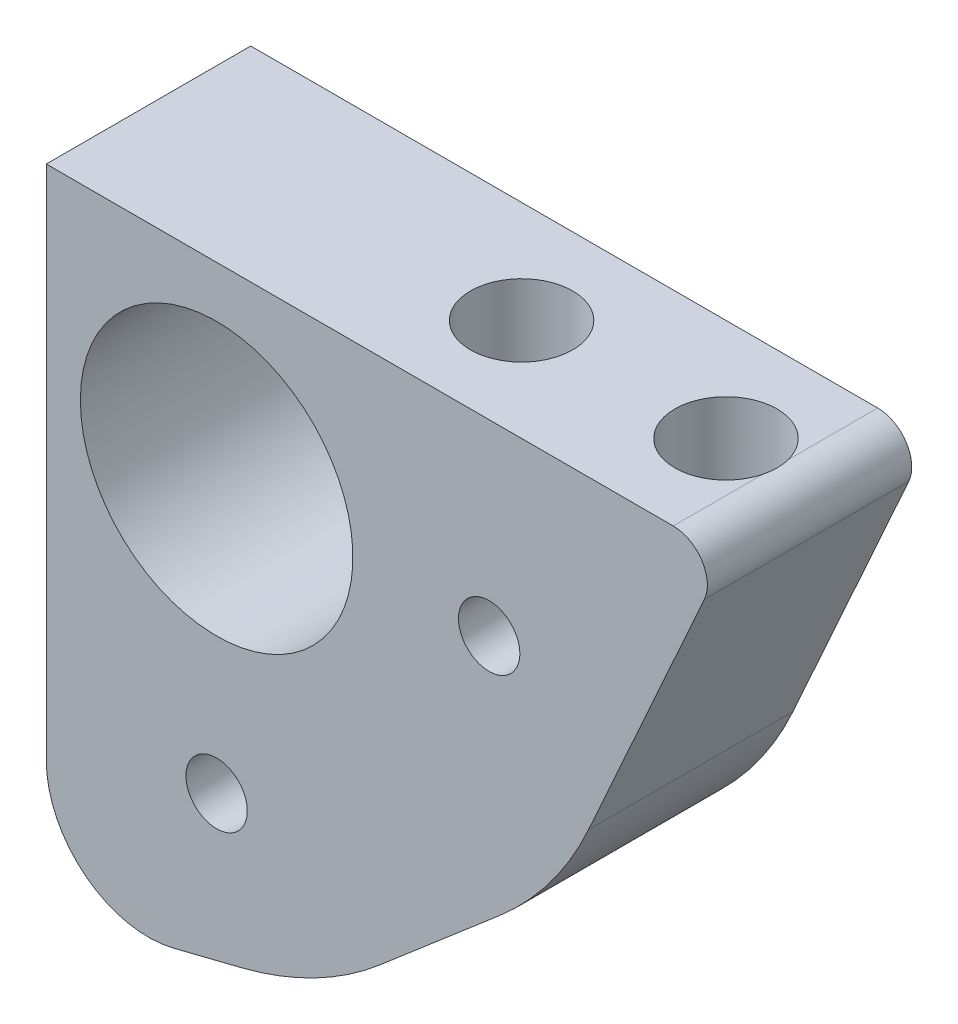
ISO-10303-21;
HEADER;
FILE_DESCRIPTION(('STEP AP214'),'2;1');
FILE_NAME('part.step','',(''),(''),'','','');
FILE_SCHEMA(('AUTOMOTIVE_DESIGN { 1 0 10303 214 1 1 1 1 }'));
ENDSEC;
DATA;
#1=APPLICATION_CONTEXT('core data for automotive mechanical design processes');
#2=APPLICATION_PROTOCOL_DEFINITION('international standard','automotive_design',2000,#1);
#3=PRODUCT_CONTEXT('',#1,'mechanical');
#4=PRODUCT('Part','Part','',(#3));
#5=PRODUCT_RELATED_PRODUCT_CATEGORY('part','',(#4));
#6=PRODUCT_DEFINITION_FORMATION('','',#4);
#7=PRODUCT_DEFINITION_CONTEXT('part definition',#1,'design');
#8=PRODUCT_DEFINITION('design','',#6,#7);
#9=PRODUCT_DEFINITION_SHAPE('','',#8);
#10=(LENGTH_UNIT() NAMED_UNIT(*) SI_UNIT(.MILLI.,.METRE.));
#11=(NAMED_UNIT(*) PLANE_ANGLE_UNIT() SI_UNIT($,.RADIAN.));
#12=(NAMED_UNIT(*) SI_UNIT($,.STERADIAN.) SOLID_ANGLE_UNIT());
#13=UNCERTAINTY_MEASURE_WITH_UNIT(LENGTH_MEASURE(1.E-05),#10,'distance_accuracy_value','');
#14=(GEOMETRIC_REPRESENTATION_CONTEXT(3) GLOBAL_UNCERTAINTY_ASSIGNED_CONTEXT((#13)) GLOBAL_UNIT_ASSIGNED_CONTEXT((#10,
#11,#12)) REPRESENTATION_CONTEXT('',''));
#15=CARTESIAN_POINT('',(0.,0.,0.));
#16=DIRECTION('',(0.,0.,1.));
#17=DIRECTION('',(1.,0.,0.));
#18=AXIS2_PLACEMENT_3D('',#15,#16,#17);
#19=CARTESIAN_POINT('',(-7.3173782982831,10.3345001147158,6.));
#20=DIRECTION('',(1.,0.,0.));
#21=DIRECTION('',(0.,0.,-1.));
#22=AXIS2_PLACEMENT_3D('',#19,#20,#21);
#23=PLANE('',#22);
#24=DIRECTION('',(0.,-1.,0.));
#25=VECTOR('',#24,1.);
#26=CARTESIAN_POINT('',(-7.3173782982831,10.3345001147158,0.));
#27=LINE('',#26,#25);
#28=CARTESIAN_POINT('',(-7.3173782982831,10.3345001147158,0.));
#29=VERTEX_POINT('',#28);
#30=CARTESIAN_POINT('',(-7.3173782982831,-4.82317066607096,0.));
#31=VERTEX_POINT('',#30);
#32=EDGE_CURVE('E187',#29,#31,#27,.T.);
#33=ORIENTED_EDGE('',*,*,#32,.T.);
#34=DIRECTION('',(0.,0.,-1.));
#35=VECTOR('',#34,1.);
#36=CARTESIAN_POINT('',(-7.3173782982831,-4.82317066607096,6.));
#37=LINE('',#36,#35);
#38=CARTESIAN_POINT('',(-7.3173782982831,-4.82317066607096,6.));
#39=VERTEX_POINT('',#38);
#40=EDGE_CURVE('E131',#31,#39,#37,.F.);
#41=ORIENTED_EDGE('',*,*,#40,.T.);
#42=DIRECTION('',(0.,-1.,0.));
#43=VECTOR('',#42,1.);
#44=CARTESIAN_POINT('',(-7.3173782982831,10.3345001147158,6.));
#45=LINE('',#44,#43);
#46=CARTESIAN_POINT('',(-7.3173782982831,10.3345001147158,6.));
#47=VERTEX_POINT('',#46);
#48=EDGE_CURVE('E173',#47,#39,#45,.T.);
#49=ORIENTED_EDGE('',*,*,#48,.F.);
#50=DIRECTION('',(0.,0.,-1.));
#51=VECTOR('',#50,1.);
#52=CARTESIAN_POINT('',(-7.3173782982831,10.3345001147158,6.));
#53=LINE('',#52,#51);
#54=EDGE_CURVE('E172',#47,#29,#53,.T.);
#55=ORIENTED_EDGE('',*,*,#54,.T.);
#56=EDGE_LOOP('',(#33,#41,#49,#55));
#57=FACE_BOUND('',#56,.T.);
#58=ADVANCED_FACE('F33',(#57),#23,.F.);
#59=CARTESIAN_POINT('',(-7.3173782982831,-8.66549988528421,6.));
#60=DIRECTION('',(-0.242535625036333,0.970142500145332,0.));
#61=DIRECTION('',(-0.970142500145332,-0.242535625036333,0.));
#62=AXIS2_PLACEMENT_3D('',#59,#60,#61);
#63=PLANE('',#62);
#64=DIRECTION('',(0.970142500145332,0.242535625036333,0.));
#65=VECTOR('',#64,1.);
#66=CARTESIAN_POINT('',(-7.3173782982831,-8.66549988528421,6.));
#67=LINE('',#66,#65);
#68=CARTESIAN_POINT('',(-3.5897714231741,-7.73359816650696,6.));
#69=VERTEX_POINT('',#68);
#70=CARTESIAN_POINT('',(-1.60757407724207,-7.23804883002395,6.));
#71=VERTEX_POINT('',#70);
#72=EDGE_CURVE('E175',#69,#71,#67,.T.);
#73=ORIENTED_EDGE('',*,*,#72,.F.);
#74=DIRECTION('',(0.,0.,-1.));
#75=VECTOR('',#74,1.);
#76=CARTESIAN_POINT('',(-3.5897714231741,-7.73359816650696,6.));
#77=LINE('',#76,#75);
#78=CARTESIAN_POINT('',(-3.5897714231741,-7.73359816650696,0.));
#79=VERTEX_POINT('',#78);
#80=EDGE_CURVE('E214',#69,#79,#77,.T.);
#81=ORIENTED_EDGE('',*,*,#80,.T.);
#82=DIRECTION('',(0.970142500145332,0.242535625036333,0.));
#83=VECTOR('',#82,1.);
#84=CARTESIAN_POINT('',(-7.3173782982831,-8.66549988528421,0.));
#85=LINE('',#84,#83);
#86=CARTESIAN_POINT('',(-1.60757407724207,-7.23804883002395,0.));
#87=VERTEX_POINT('',#86);
#88=EDGE_CURVE('E190',#79,#87,#85,.T.);
#89=ORIENTED_EDGE('',*,*,#88,.T.);
#90=DIRECTION('',(0.,0.,-1.));
#91=VECTOR('',#90,1.);
#92=CARTESIAN_POINT('',(-1.60757407724207,-7.23804883002395,6.));
#93=LINE('',#92,#91);
#94=EDGE_CURVE('E211',#87,#71,#93,.F.);
#95=ORIENTED_EDGE('',*,*,#94,.T.);
#96=EDGE_LOOP('',(#73,#81,#89,#95));
#97=FACE_BOUND('',#96,.T.);
#98=ADVANCED_FACE('F223',(#97),#63,.F.);
#99=CARTESIAN_POINT('',(7.6826217017169,-0.66549988528421,6.));
#100=DIRECTION('',(0.650791373455968,-0.759256602365296,0.));
#101=DIRECTION('',(0.759256602365297,0.650791373455968,0.));
#102=AXIS2_PLACEMENT_3D('',#99,#100,#101);
#103=PLANE('',#102);
#104=DIRECTION('',(-0.759256602365297,-0.650791373455969,0.));
#105=VECTOR('',#104,1.);
#106=CARTESIAN_POINT('',(7.6826217017169,-0.66549988528421,0.));
#107=LINE('',#106,#105);
#108=CARTESIAN_POINT('',(5.98790422580152,-2.11811486464025,0.));
#109=VERTEX_POINT('',#108);
#110=CARTESIAN_POINT('',(2.47498340695428,-5.1291898522236,0.));
#111=VERTEX_POINT('',#110);
#112=EDGE_CURVE('E163',#109,#111,#107,.T.);
#113=ORIENTED_EDGE('',*,*,#112,.F.);
#114=DIRECTION('',(0.,0.,-1.));
#115=VECTOR('',#114,1.);
#116=CARTESIAN_POINT('',(5.98790422580152,-2.11811486464025,6.));
#117=LINE('',#116,#115);
#118=CARTESIAN_POINT('',(5.98790422580152,-2.11811486464025,6.));
#119=VERTEX_POINT('',#118);
#120=EDGE_CURVE('E205',#109,#119,#117,.F.);
#121=ORIENTED_EDGE('',*,*,#120,.T.);
#122=DIRECTION('',(-0.759256602365297,-0.650791373455969,0.));
#123=VECTOR('',#122,1.);
#124=CARTESIAN_POINT('',(7.6826217017169,-0.66549988528421,6.));
#125=LINE('',#124,#123);
#126=CARTESIAN_POINT('',(2.47498340695428,-5.1291898522236,6.));
#127=VERTEX_POINT('',#126);
#128=EDGE_CURVE('E183',#119,#127,#125,.T.);
#129=ORIENTED_EDGE('',*,*,#128,.T.);
#130=DIRECTION('',(0.,0.,-1.));
#131=VECTOR('',#130,1.);
#132=CARTESIAN_POINT('',(2.47498340695428,-5.1291898522236,0.));
#133=LINE('',#132,#131);
#134=EDGE_CURVE('E202',#127,#111,#133,.T.);
#135=ORIENTED_EDGE('',*,*,#134,.T.);
#136=EDGE_LOOP('',(#113,#121,#129,#135));
#137=FACE_BOUND('',#136,.T.);
#138=ADVANCED_FACE('F232',(#137),#103,.T.);
#139=CARTESIAN_POINT('',(7.6826217017169,-0.66549988528421,6.));
#140=DIRECTION('',(-0.911880112420202,0.410456648834588,0.));
#141=DIRECTION('',(-0.410456648834588,-0.911880112420202,0.));
#142=AXIS2_PLACEMENT_3D('',#139,#140,#141);
#143=PLANE('',#142);
#144=DIRECTION('',(0.410456648834588,0.911880112420202,0.));
#145=VECTOR('',#144,1.);
#146=CARTESIAN_POINT('',(7.6826217017169,-0.66549988528421,0.));
#147=LINE('',#146,#145);
#148=CARTESIAN_POINT('',(8.59879161544386,1.36988467066684,0.));
#149=VERTEX_POINT('',#148);
#150=CARTESIAN_POINT('',(11.9990792866144,8.9240434658812,0.));
#151=VERTEX_POINT('',#150);
#152=EDGE_CURVE('E156',#149,#151,#147,.T.);
#153=ORIENTED_EDGE('',*,*,#152,.T.);
#154=DIRECTION('',(0.,0.,-1.));
#155=VECTOR('',#154,1.);
#156=CARTESIAN_POINT('',(11.9990792866144,8.9240434658812,6.));
#157=LINE('',#156,#155);
#158=CARTESIAN_POINT('',(11.9990792866144,8.9240434658812,6.));
#159=VERTEX_POINT('',#158);
#160=EDGE_CURVE('E57',#151,#159,#157,.F.);
#161=ORIENTED_EDGE('',*,*,#160,.T.);
#162=DIRECTION('',(0.410456648834588,0.911880112420202,0.));
#163=VECTOR('',#162,1.);
#164=CARTESIAN_POINT('',(7.6826217017169,-0.66549988528421,6.));
#165=LINE('',#164,#163);
#166=CARTESIAN_POINT('',(8.59879161544386,1.36988467066684,6.));
#167=VERTEX_POINT('',#166);
#168=EDGE_CURVE('E169',#167,#159,#165,.T.);
#169=ORIENTED_EDGE('',*,*,#168,.F.);
#170=DIRECTION('',(0.,0.,-1.));
#171=VECTOR('',#170,1.);
#172=CARTESIAN_POINT('',(8.59879161544386,1.36988467066684,0.));
#173=LINE('',#172,#171);
#174=EDGE_CURVE('E162',#167,#149,#173,.T.);
#175=ORIENTED_EDGE('',*,*,#174,.T.);
#176=EDGE_LOOP('',(#153,#161,#169,#175));
#177=FACE_BOUND('',#176,.T.);
#178=ADVANCED_FACE('F160',(#177),#143,.F.);
#179=CARTESIAN_POINT('',(12.6339558471642,10.3345001147158,6.));
#180=DIRECTION('',(0.,-1.,0.));
#181=DIRECTION('',(0.,0.,-1.));
#182=AXIS2_PLACEMENT_3D('',#179,#180,#181);
#183=PLANE('',#182);
#184=CARTESIAN_POINT('',(3.6339558471642,10.3345001147158,3.));
#185=DIRECTION('',(0.,1.,0.));
#186=DIRECTION('',(-1.,0.,0.));
#187=AXIS2_PLACEMENT_3D('',#184,#185,#186);
#188=CIRCLE('',#187,1.5);
#189=CARTESIAN_POINT('',(2.1339558471642,10.3345001147158,3.));
#190=VERTEX_POINT('',#189);
#191=EDGE_CURVE('E300',#190,#190,#188,.T.);
#192=ORIENTED_EDGE('',*,*,#191,.F.);
#193=EDGE_LOOP('',(#192));
#194=FACE_BOUND('',#193,.T.);
#195=DIRECTION('',(0.,0.,-1.));
#196=VECTOR('',#195,1.);
#197=CARTESIAN_POINT('',(11.0871991741942,10.3345001147158,6.));
#198=LINE('',#197,#196);
#199=CARTESIAN_POINT('',(11.0871991741942,10.3345001147158,6.));
#200=VERTEX_POINT('',#199);
#201=CARTESIAN_POINT('',(11.0871991741942,10.3345001147158,3.37159632996413));
#202=VERTEX_POINT('',#201);
#203=EDGE_CURVE('E125',#200,#202,#198,.T.);
#204=ORIENTED_EDGE('',*,*,#203,.T.);
#205=CARTESIAN_POINT('',(9.6339558471642,10.3345001147158,3.));
#206=DIRECTION('',(0.,1.,0.));
#207=DIRECTION('',(-1.,0.,0.));
#208=AXIS2_PLACEMENT_3D('',#205,#206,#207);
#209=CIRCLE('',#208,1.5);
#210=CARTESIAN_POINT('',(11.0871991741942,10.3345001147158,2.62840367003587));
#211=VERTEX_POINT('',#210);
#212=EDGE_CURVE('E49',#211,#202,#209,.T.);
#213=ORIENTED_EDGE('',*,*,#212,.F.);
#214=CARTESIAN_POINT('',(11.0871991741942,10.3345001147158,0.));
#215=VERTEX_POINT('',#214);
#216=EDGE_CURVE('E38',#211,#215,#198,.T.);
#217=ORIENTED_EDGE('',*,*,#216,.T.);
#218=DIRECTION('',(-1.,0.,0.));
#219=VECTOR('',#218,1.);
#220=CARTESIAN_POINT('',(12.6339558471642,10.3345001147158,0.));
#221=LINE('',#220,#219);
#222=EDGE_CURVE('E158',#215,#29,#221,.T.);
#223=ORIENTED_EDGE('',*,*,#222,.T.);
#224=ORIENTED_EDGE('',*,*,#54,.F.);
#225=DIRECTION('',(-1.,0.,0.));
#226=VECTOR('',#225,1.);
#227=CARTESIAN_POINT('',(7.6826217017169,10.3345001147158,6.));
#228=LINE('',#227,#226);
#229=EDGE_CURVE('E167',#200,#47,#228,.T.);
#230=ORIENTED_EDGE('',*,*,#229,.F.);
#231=EDGE_LOOP('',(#204,#213,#217,#223,#224,#230));
#232=FACE_BOUND('',#231,.T.);
#233=ADVANCED_FACE('F122',(#194,#232),#183,.F.);
#234=CARTESIAN_POINT('',(0.,0.,6.));
#235=DIRECTION('',(0.,0.,1.));
#236=DIRECTION('',(1.,0.,0.));
#237=AXIS2_PLACEMENT_3D('',#234,#235,#236);
#238=PLANE('',#237);
#239=CARTESIAN_POINT('',(-2.3173782982831,-3.16549988528421,6.));
#240=DIRECTION('',(0.,0.,-1.));
#241=DIRECTION('',(-1.,0.,0.));
#242=AXIS2_PLACEMENT_3D('',#239,#240,#241);
#243=CIRCLE('',#242,0.89999999998926);
#244=CARTESIAN_POINT('',(-3.21737829827236,-3.16549988528421,6.));
#245=VERTEX_POINT('',#244);
#246=EDGE_CURVE('E309',#245,#245,#243,.T.);
#247=ORIENTED_EDGE('',*,*,#246,.T.);
#248=EDGE_LOOP('',(#247));
#249=FACE_BOUND('',#248,.T.);
#250=CARTESIAN_POINT('',(5.6826217017169,4.83450011471579,6.));
#251=DIRECTION('',(0.,0.,-1.));
#252=DIRECTION('',(-1.,0.,0.));
#253=AXIS2_PLACEMENT_3D('',#250,#251,#252);
#254=CIRCLE('',#253,0.9);
#255=CARTESIAN_POINT('',(4.7826217017169,4.83450011471579,6.));
#256=VERTEX_POINT('',#255);
#257=EDGE_CURVE('E315',#256,#256,#254,.T.);
#258=ORIENTED_EDGE('',*,*,#257,.T.);
#259=EDGE_LOOP('',(#258));
#260=FACE_BOUND('',#259,.T.);
#261=CARTESIAN_POINT('',(-2.3173782982831,4.83450011471579,6.));
#262=DIRECTION('',(0.,0.,-1.));
#263=DIRECTION('',(-1.,0.,0.));
#264=AXIS2_PLACEMENT_3D('',#261,#262,#263);
#265=CIRCLE('',#264,4.);
#266=CARTESIAN_POINT('',(-6.3173782982831,4.83450011471579,6.));
#267=VERTEX_POINT('',#266);
#268=EDGE_CURVE('E191',#267,#267,#265,.T.);
#269=ORIENTED_EDGE('',*,*,#268,.T.);
#270=EDGE_LOOP('',(#269));
#271=FACE_BOUND('',#270,.T.);
#272=ORIENTED_EDGE('',*,*,#168,.T.);
#273=CARTESIAN_POINT('',(11.0871991741942,9.33450011471579,6.));
#274=DIRECTION('',(0.,0.,1.));
#275=DIRECTION('',(1.,0.,0.));
#276=AXIS2_PLACEMENT_3D('',#273,#274,#275);
#277=CIRCLE('',#276,1.);
#278=EDGE_CURVE('E44',#159,#200,#277,.T.);
#279=ORIENTED_EDGE('',*,*,#278,.T.);
#280=ORIENTED_EDGE('',*,*,#229,.T.);
#281=ORIENTED_EDGE('',*,*,#48,.T.);
#282=CARTESIAN_POINT('',(-4.3173782982831,-4.82317066607096,6.));
#283=DIRECTION('',(0.,0.,1.));
#284=DIRECTION('',(1.,0.,0.));
#285=AXIS2_PLACEMENT_3D('',#282,#283,#284);
#286=CIRCLE('',#285,3.);
#287=EDGE_CURVE('E130',#39,#69,#286,.T.);
#288=ORIENTED_EDGE('',*,*,#287,.T.);
#289=ORIENTED_EDGE('',*,*,#72,.T.);
#290=CARTESIAN_POINT('',(-4.0329303276054,2.46337617142936,6.));
#291=DIRECTION('',(0.,0.,1.));
#292=DIRECTION('',(1.,0.,0.));
#293=AXIS2_PLACEMENT_3D('',#290,#291,#292);
#294=CIRCLE('',#293,10.);
#295=EDGE_CURVE('E207',#71,#127,#294,.T.);
#296=ORIENTED_EDGE('',*,*,#295,.T.);
#297=ORIENTED_EDGE('',*,*,#128,.F.);
#298=CARTESIAN_POINT('',(-0.52000950875816,5.47445115901272,6.));
#299=DIRECTION('',(0.,0.,1.));
#300=DIRECTION('',(1.,0.,0.));
#301=AXIS2_PLACEMENT_3D('',#298,#299,#300);
#302=CIRCLE('',#301,10.);
#303=EDGE_CURVE('E209',#119,#167,#302,.T.);
#304=ORIENTED_EDGE('',*,*,#303,.T.);
#305=EDGE_LOOP('',(#272,#279,#280,#281,#288,#289,#296,#297,#304));
#306=FACE_BOUND('',#305,.T.);
#307=ADVANCED_FACE('F166',(#249,#260,#271,#306),#238,.T.);
#308=CARTESIAN_POINT('',(0.,0.,0.));
#309=DIRECTION('',(0.,0.,1.));
#310=DIRECTION('',(1.,0.,0.));
#311=AXIS2_PLACEMENT_3D('',#308,#309,#310);
#312=PLANE('',#311);
#313=CARTESIAN_POINT('',(-2.3173782982831,-3.16549988528421,0.));
#314=DIRECTION('',(0.,0.,-1.));
#315=DIRECTION('',(-1.,0.,0.));
#316=AXIS2_PLACEMENT_3D('',#313,#314,#315);
#317=CIRCLE('',#316,0.89999999998926);
#318=CARTESIAN_POINT('',(-3.21737829827236,-3.16549988528421,0.));
#319=VERTEX_POINT('',#318);
#320=EDGE_CURVE('E307',#319,#319,#317,.T.);
#321=ORIENTED_EDGE('',*,*,#320,.F.);
#322=EDGE_LOOP('',(#321));
#323=FACE_BOUND('',#322,.T.);
#324=CARTESIAN_POINT('',(5.6826217017169,4.83450011471579,0.));
#325=DIRECTION('',(0.,0.,-1.));
#326=DIRECTION('',(-1.,0.,0.));
#327=AXIS2_PLACEMENT_3D('',#324,#325,#326);
#328=CIRCLE('',#327,0.9);
#329=CARTESIAN_POINT('',(4.7826217017169,4.83450011471579,0.));
#330=VERTEX_POINT('',#329);
#331=EDGE_CURVE('E312',#330,#330,#328,.T.);
#332=ORIENTED_EDGE('',*,*,#331,.F.);
#333=EDGE_LOOP('',(#332));
#334=FACE_BOUND('',#333,.T.);
#335=CARTESIAN_POINT('',(-2.3173782982831,4.83450011471579,0.));
#336=DIRECTION('',(0.,0.,-1.));
#337=DIRECTION('',(-1.,0.,0.));
#338=AXIS2_PLACEMENT_3D('',#335,#336,#337);
#339=CIRCLE('',#338,4.);
#340=CARTESIAN_POINT('',(-6.3173782982831,4.83450011471579,0.));
#341=VERTEX_POINT('',#340);
#342=EDGE_CURVE('E179',#341,#341,#339,.T.);
#343=ORIENTED_EDGE('',*,*,#342,.F.);
#344=EDGE_LOOP('',(#343));
#345=FACE_BOUND('',#344,.T.);
#346=ORIENTED_EDGE('',*,*,#222,.F.);
#347=CARTESIAN_POINT('',(11.0871991741942,9.33450011471579,0.));
#348=DIRECTION('',(0.,0.,1.));
#349=DIRECTION('',(1.,0.,0.));
#350=AXIS2_PLACEMENT_3D('',#347,#348,#349);
#351=CIRCLE('',#350,1.);
#352=EDGE_CURVE('E128',#215,#151,#351,.F.);
#353=ORIENTED_EDGE('',*,*,#352,.T.);
#354=ORIENTED_EDGE('',*,*,#152,.F.);
#355=CARTESIAN_POINT('',(-0.52000950875816,5.47445115901272,0.));
#356=DIRECTION('',(0.,0.,1.));
#357=DIRECTION('',(1.,0.,0.));
#358=AXIS2_PLACEMENT_3D('',#355,#356,#357);
#359=CIRCLE('',#358,10.);
#360=EDGE_CURVE('E200',#149,#109,#359,.F.);
#361=ORIENTED_EDGE('',*,*,#360,.T.);
#362=ORIENTED_EDGE('',*,*,#112,.T.);
#363=CARTESIAN_POINT('',(-4.0329303276054,2.46337617142936,0.));
#364=DIRECTION('',(0.,0.,1.));
#365=DIRECTION('',(1.,0.,0.));
#366=AXIS2_PLACEMENT_3D('',#363,#364,#365);
#367=CIRCLE('',#366,10.);
#368=EDGE_CURVE('E197',#111,#87,#367,.F.);
#369=ORIENTED_EDGE('',*,*,#368,.T.);
#370=ORIENTED_EDGE('',*,*,#88,.F.);
#371=CARTESIAN_POINT('',(-4.3173782982831,-4.82317066607096,0.));
#372=DIRECTION('',(0.,0.,1.));
#373=DIRECTION('',(1.,0.,0.));
#374=AXIS2_PLACEMENT_3D('',#371,#372,#373);
#375=CIRCLE('',#374,3.);
#376=EDGE_CURVE('E137',#79,#31,#375,.F.);
#377=ORIENTED_EDGE('',*,*,#376,.T.);
#378=ORIENTED_EDGE('',*,*,#32,.F.);
#379=EDGE_LOOP('',(#346,#353,#354,#361,#362,#369,#370,#377,#378));
#380=FACE_BOUND('',#379,.T.);
#381=ADVANCED_FACE('F155',(#323,#334,#345,#380),#312,.F.);
#382=CARTESIAN_POINT('',(-2.3173782982831,4.83450011471579,6.));
#383=DIRECTION('',(0.,0.,-1.));
#384=DIRECTION('',(-1.,0.,0.));
#385=AXIS2_PLACEMENT_3D('',#382,#383,#384);
#386=CYLINDRICAL_SURFACE('',#385,4.);
#387=ORIENTED_EDGE('',*,*,#268,.F.);
#388=EDGE_LOOP('',(#387));
#389=FACE_BOUND('',#388,.T.);
#390=ORIENTED_EDGE('',*,*,#342,.T.);
#391=EDGE_LOOP('',(#390));
#392=FACE_BOUND('',#391,.T.);
#393=ADVANCED_FACE('F264',(#389,#392),#386,.F.);
#394=CARTESIAN_POINT('',(5.6826217017169,4.83450011471579,6.));
#395=DIRECTION('',(0.,0.,-1.));
#396=DIRECTION('',(-1.,0.,0.));
#397=AXIS2_PLACEMENT_3D('',#394,#395,#396);
#398=CYLINDRICAL_SURFACE('',#397,0.9);
#399=ORIENTED_EDGE('',*,*,#257,.F.);
#400=EDGE_LOOP('',(#399));
#401=FACE_BOUND('',#400,.T.);
#402=ORIENTED_EDGE('',*,*,#331,.T.);
#403=EDGE_LOOP('',(#402));
#404=FACE_BOUND('',#403,.T.);
#405=ADVANCED_FACE('F245',(#401,#404),#398,.F.);
#406=CARTESIAN_POINT('',(-2.3173782982831,-3.16549988528421,6.));
#407=DIRECTION('',(0.,0.,-1.));
#408=DIRECTION('',(-1.,0.,0.));
#409=AXIS2_PLACEMENT_3D('',#406,#407,#408);
#410=CYLINDRICAL_SURFACE('',#409,0.89999999998926);
#411=ORIENTED_EDGE('',*,*,#246,.F.);
#412=EDGE_LOOP('',(#411));
#413=FACE_BOUND('',#412,.T.);
#414=ORIENTED_EDGE('',*,*,#320,.T.);
#415=EDGE_LOOP('',(#414));
#416=FACE_BOUND('',#415,.T.);
#417=ADVANCED_FACE('F238',(#413,#416),#410,.F.);
#418=CARTESIAN_POINT('',(-0.52000950875816,5.47445115901272,6.));
#419=DIRECTION('',(0.,0.,1.));
#420=DIRECTION('',(1.,0.,0.));
#421=AXIS2_PLACEMENT_3D('',#418,#419,#420);
#422=CYLINDRICAL_SURFACE('',#421,10.);
#423=ORIENTED_EDGE('',*,*,#303,.F.);
#424=ORIENTED_EDGE('',*,*,#120,.F.);
#425=ORIENTED_EDGE('',*,*,#360,.F.);
#426=ORIENTED_EDGE('',*,*,#174,.F.);
#427=EDGE_LOOP('',(#423,#424,#425,#426));
#428=FACE_BOUND('',#427,.T.);
#429=ADVANCED_FACE('F236',(#428),#422,.T.);
#430=CARTESIAN_POINT('',(-4.0329303276054,2.46337617142936,6.));
#431=DIRECTION('',(0.,0.,1.));
#432=DIRECTION('',(1.,0.,0.));
#433=AXIS2_PLACEMENT_3D('',#430,#431,#432);
#434=CYLINDRICAL_SURFACE('',#433,10.);
#435=ORIENTED_EDGE('',*,*,#295,.F.);
#436=ORIENTED_EDGE('',*,*,#94,.F.);
#437=ORIENTED_EDGE('',*,*,#368,.F.);
#438=ORIENTED_EDGE('',*,*,#134,.F.);
#439=EDGE_LOOP('',(#435,#436,#437,#438));
#440=FACE_BOUND('',#439,.T.);
#441=ADVANCED_FACE('F234',(#440),#434,.T.);
#442=CARTESIAN_POINT('',(-4.3173782982831,-4.82317066607096,6.));
#443=DIRECTION('',(0.,0.,-1.));
#444=DIRECTION('',(-1.,0.,0.));
#445=AXIS2_PLACEMENT_3D('',#442,#443,#444);
#446=CYLINDRICAL_SURFACE('',#445,3.);
#447=ORIENTED_EDGE('',*,*,#287,.F.);
#448=ORIENTED_EDGE('',*,*,#40,.F.);
#449=ORIENTED_EDGE('',*,*,#376,.F.);
#450=ORIENTED_EDGE('',*,*,#80,.F.);
#451=EDGE_LOOP('',(#447,#448,#449,#450));
#452=FACE_BOUND('',#451,.T.);
#453=ADVANCED_FACE('F221',(#452),#446,.T.);
#454=CARTESIAN_POINT('',(11.0871991741942,9.33450011471579,6.));
#455=DIRECTION('',(0.,0.,-1.));
#456=DIRECTION('',(-1.,0.,0.));
#457=AXIS2_PLACEMENT_3D('',#454,#455,#456);
#458=CYLINDRICAL_SURFACE('',#457,1.);
#459=CARTESIAN_POINT('',(11.0871991741942,10.3345001147158,3.37159632996413));
#460=CARTESIAN_POINT('',(11.0923487943372,10.3345004312291,3.35145822140822));
#461=CARTESIAN_POINT('',(11.0970793047133,10.3344901464573,3.33121296206143));
#462=CARTESIAN_POINT('',(11.10569508719,10.3344493239214,3.29054337798091));
#463=CARTESIAN_POINT('',(11.1095803584881,10.3344187861381,3.27011905307719));
#464=CARTESIAN_POINT('',(11.1164986408304,10.3343384070833,3.22912657353149));
#465=CARTESIAN_POINT('',(11.1195316502562,10.3342885657752,3.20855841861645));
#466=CARTESIAN_POINT('',(11.1247402500685,10.3341648321789,3.16731379924654));
#467=CARTESIAN_POINT('',(11.1269158380127,10.3340909398221,3.14663733448333));
#468=CARTESIAN_POINT('',(11.130405819618,10.3339371447819,3.10521196829346));
#469=CARTESIAN_POINT('',(11.1317202100084,10.3338572420757,3.08446306659199));
#470=CARTESIAN_POINT('',(11.1334855112768,10.3336240109656,3.0429281260737));
#471=CARTESIAN_POINT('',(11.1339364180554,10.333470682213,3.02214208708105));
#472=CARTESIAN_POINT('',(11.1339660835919,10.3333694147067,2.98937083067851));
#473=CARTESIAN_POINT('',(11.1338332590667,10.3333620034411,2.97738528850032));
#474=CARTESIAN_POINT('',(11.1330745149638,10.3333878016254,2.94449861885588));
#475=CARTESIAN_POINT('',(11.132155090739,10.3334553641583,2.92360371345328));
#476=CARTESIAN_POINT('',(11.1288645338256,10.3336368317016,2.8729645459383));
#477=CARTESIAN_POINT('',(11.126041349701,10.3337582095779,2.84324878921793));
#478=CARTESIAN_POINT('',(11.1188646602911,10.3339991886208,2.78592987493515));
#479=CARTESIAN_POINT('',(11.1146203679422,10.3341184084502,2.75831296694128));
#480=CARTESIAN_POINT('',(11.1058469342705,10.3343062252824,2.7102137003429));
#481=CARTESIAN_POINT('',(11.1016528426591,10.3343800320582,2.68966979954547));
#482=CARTESIAN_POINT('',(11.0939438666863,10.3344658806215,2.65557154336997));
#483=CARTESIAN_POINT('',(11.0906664566525,10.3344902972261,2.64196324364516));
#484=CARTESIAN_POINT('',(11.0871991741942,10.3345001147158,2.62840367003587));
#485=B_SPLINE_CURVE_WITH_KNOTS('',3,(#459,#460,#461,#462,#463,#464,#465,#466,#467,#468,#469,
#470,#471,#472,#473,#474,#475,#476,#477,#478,#479,#480,#481,#482,#483,#484),.UNSPECIFIED.,.F.,
.F.,(4,2,2,2,2,2,2,2,2,2,2,2,4),(0.,0.0623537857775878,0.124707630759818,0.187061594151558,
0.249415735157346,0.311770112981208,0.374124786826499,0.410080754963523,0.472808058882536,
0.562302011802581,0.646082139811411,0.708967090028088,0.750953894747221),.UNSPECIFIED.);
#486=EDGE_CURVE('E11',#202,#211,#485,.T.);
#487=ORIENTED_EDGE('',*,*,#486,.F.);
#488=ORIENTED_EDGE('',*,*,#203,.F.);
#489=ORIENTED_EDGE('',*,*,#278,.F.);
#490=ORIENTED_EDGE('',*,*,#160,.F.);
#491=ORIENTED_EDGE('',*,*,#352,.F.);
#492=ORIENTED_EDGE('',*,*,#216,.F.);
#493=EDGE_LOOP('',(#487,#488,#489,#490,#491,#492));
#494=FACE_BOUND('',#493,.T.);
#495=ADVANCED_FACE('F35',(#494),#458,.T.);
#496=CARTESIAN_POINT('',(3.6339558471642,7.33450011471579,3.));
#497=DIRECTION('',(0.,1.,0.));
#498=DIRECTION('',(-1.,0.,0.));
#499=AXIS2_PLACEMENT_3D('',#496,#497,#498);
#500=CYLINDRICAL_SURFACE('',#499,1.5);
#501=CARTESIAN_POINT('',(3.6339558471642,7.33450011471579,3.));
#502=DIRECTION('',(0.,1.,0.));
#503=DIRECTION('',(-1.,0.,0.));
#504=AXIS2_PLACEMENT_3D('',#501,#502,#503);
#505=CIRCLE('',#504,1.5);
#506=CARTESIAN_POINT('',(2.1339558471642,7.33450011471579,3.));
#507=VERTEX_POINT('',#506);
#508=EDGE_CURVE('E295',#507,#507,#505,.T.);
#509=ORIENTED_EDGE('',*,*,#508,.F.);
#510=EDGE_LOOP('',(#509));
#511=FACE_BOUND('',#510,.T.);
#512=ORIENTED_EDGE('',*,*,#191,.T.);
#513=EDGE_LOOP('',(#512));
#514=FACE_BOUND('',#513,.T.);
#515=ADVANCED_FACE('F275',(#511,#514),#500,.F.);
#516=CARTESIAN_POINT('',(3.6339558471642,7.33450011471579,3.));
#517=DIRECTION('',(0.,1.,0.));
#518=DIRECTION('',(-1.,0.,0.));
#519=AXIS2_PLACEMENT_3D('',#516,#517,#518);
#520=PLANE('',#519);
#521=ORIENTED_EDGE('',*,*,#508,.T.);
#522=EDGE_LOOP('',(#521));
#523=FACE_BOUND('',#522,.T.);
#524=ADVANCED_FACE('F278',(#523),#520,.T.);
#525=CARTESIAN_POINT('',(9.6339558471642,7.33450011471579,3.));
#526=DIRECTION('',(0.,1.,0.));
#527=DIRECTION('',(-1.,0.,0.));
#528=AXIS2_PLACEMENT_3D('',#525,#526,#527);
#529=CYLINDRICAL_SURFACE('',#528,1.5);
#530=ORIENTED_EDGE('',*,*,#486,.T.);
#531=ORIENTED_EDGE('',*,*,#212,.T.);
#532=EDGE_LOOP('',(#530,#531));
#533=FACE_BOUND('',#532,.T.);
#534=CARTESIAN_POINT('',(9.6339558471642,7.33450011471579,3.));
#535=DIRECTION('',(0.,1.,0.));
#536=DIRECTION('',(-1.,0.,0.));
#537=AXIS2_PLACEMENT_3D('',#534,#535,#536);
#538=CIRCLE('',#537,1.5);
#539=CARTESIAN_POINT('',(8.1339558471642,7.33450011471579,3.));
#540=VERTEX_POINT('',#539);
#541=EDGE_CURVE('E126',#540,#540,#538,.T.);
#542=ORIENTED_EDGE('',*,*,#541,.F.);
#543=EDGE_LOOP('',(#542));
#544=FACE_BOUND('',#543,.T.);
#545=ADVANCED_FACE('F112',(#533,#544),#529,.F.);
#546=CARTESIAN_POINT('',(9.6339558471642,7.33450011471579,3.));
#547=DIRECTION('',(0.,1.,0.));
#548=DIRECTION('',(-1.,0.,0.));
#549=AXIS2_PLACEMENT_3D('',#546,#547,#548);
#550=PLANE('',#549);
#551=ORIENTED_EDGE('',*,*,#541,.T.);
#552=EDGE_LOOP('',(#551));
#553=FACE_BOUND('',#552,.T.);
#554=ADVANCED_FACE('F286',(#553),#550,.T.);
#555=CLOSED_SHELL('',(#58,#98,#138,#178,#233,#307,#381,#393,#405,#417,#429,#441,#453,#495,#515,
#524,#545,#554));
#556=MANIFOLD_SOLID_BREP('B2',#555);
#557=ADVANCED_BREP_SHAPE_REPRESENTATION('',(#18,#556),#14);
#558=SHAPE_DEFINITION_REPRESENTATION(#9,#557);
ENDSEC;
END-ISO-10303-21;
